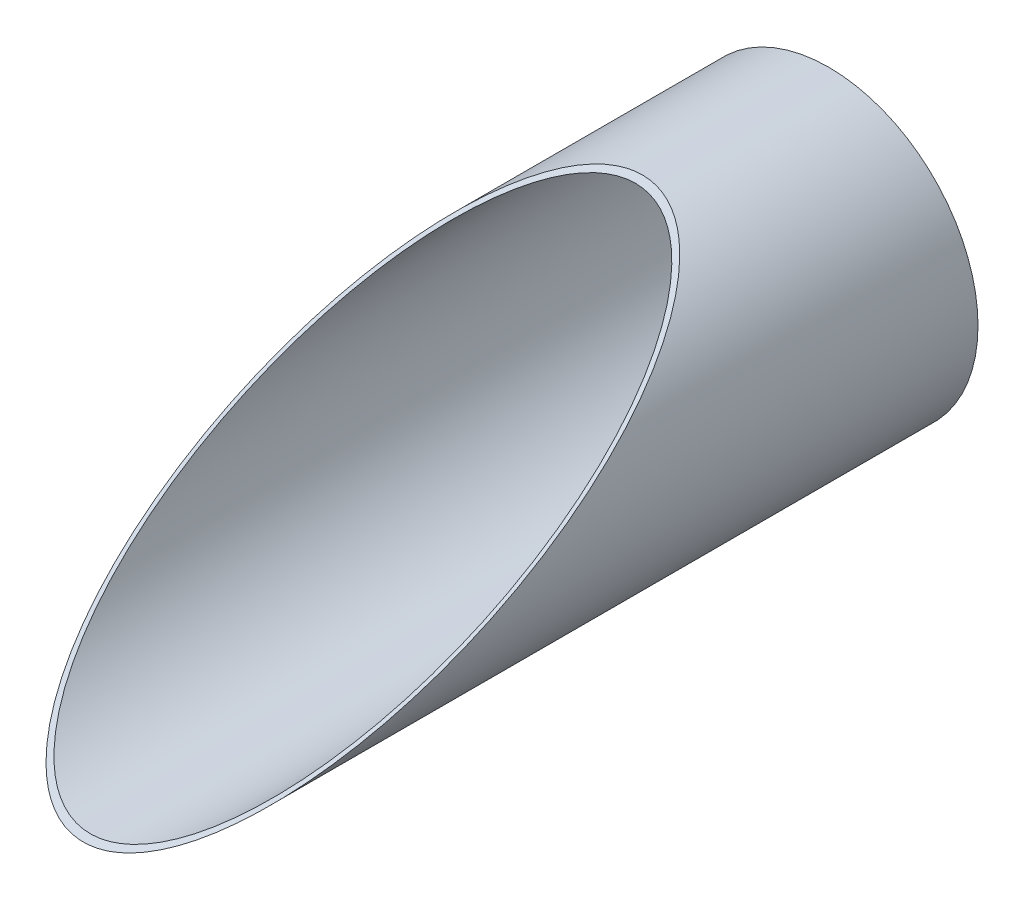
ISO-10303-21;
HEADER;
FILE_DESCRIPTION(('STEP AP214'),'2;1');
FILE_NAME('part.step','',(''),(''),'','','');
FILE_SCHEMA(('AUTOMOTIVE_DESIGN { 1 0 10303 214 1 1 1 1 }'));
ENDSEC;
DATA;
#1=APPLICATION_CONTEXT('core data for automotive mechanical design processes');
#2=APPLICATION_PROTOCOL_DEFINITION('international standard','automotive_design',2000,#1);
#3=PRODUCT_CONTEXT('',#1,'mechanical');
#4=PRODUCT('Part','Part','',(#3));
#5=PRODUCT_RELATED_PRODUCT_CATEGORY('part','',(#4));
#6=PRODUCT_DEFINITION_FORMATION('','',#4);
#7=PRODUCT_DEFINITION_CONTEXT('part definition',#1,'design');
#8=PRODUCT_DEFINITION('design','',#6,#7);
#9=PRODUCT_DEFINITION_SHAPE('','',#8);
#10=(LENGTH_UNIT() NAMED_UNIT(*) SI_UNIT(.MILLI.,.METRE.));
#11=(NAMED_UNIT(*) PLANE_ANGLE_UNIT() SI_UNIT($,.RADIAN.));
#12=(NAMED_UNIT(*) SI_UNIT($,.STERADIAN.) SOLID_ANGLE_UNIT());
#13=UNCERTAINTY_MEASURE_WITH_UNIT(LENGTH_MEASURE(1.E-05),#10,'distance_accuracy_value','');
#14=(GEOMETRIC_REPRESENTATION_CONTEXT(3) GLOBAL_UNCERTAINTY_ASSIGNED_CONTEXT((#13)) GLOBAL_UNIT_ASSIGNED_CONTEXT((#10,
#11,#12)) REPRESENTATION_CONTEXT('',''));
#15=CARTESIAN_POINT('',(0.,0.,0.));
#16=DIRECTION('',(0.,0.,1.));
#17=DIRECTION('',(1.,0.,0.));
#18=AXIS2_PLACEMENT_3D('',#15,#16,#17);
#19=CARTESIAN_POINT('',(0.,0.,100.));
#20=DIRECTION('',(0.,0.,-1.));
#21=DIRECTION('',(-1.,0.,0.));
#22=AXIS2_PLACEMENT_3D('',#19,#20,#21);
#23=CYLINDRICAL_SURFACE('',#22,20.);
#24=CARTESIAN_POINT('',(0.,0.,0.));
#25=DIRECTION('',(0.,0.,1.));
#26=DIRECTION('',(1.,0.,0.));
#27=AXIS2_PLACEMENT_3D('',#24,#25,#26);
#28=CIRCLE('',#27,20.);
#29=CARTESIAN_POINT('',(20.,0.,0.));
#30=VERTEX_POINT('',#29);
#31=EDGE_CURVE('E10',#30,#30,#28,.T.);
#32=ORIENTED_EDGE('',*,*,#31,.T.);
#33=EDGE_LOOP('',(#32));
#34=FACE_BOUND('',#33,.T.);
#35=CARTESIAN_POINT('',(0.,0.,62.5));
#36=DIRECTION('',(0.,-0.882352941176471,-0.470588235294118));
#37=DIRECTION('',(0.,0.470588235294118,-0.882352941176471));
#38=AXIS2_PLACEMENT_3D('',#35,#36,#37);
#39=ELLIPSE('',#38,42.5,20.);
#40=CARTESIAN_POINT('',(0.,20.,25.));
#41=VERTEX_POINT('',#40);
#42=EDGE_CURVE('E44',#41,#41,#39,.T.);
#43=ORIENTED_EDGE('',*,*,#42,.T.);
#44=EDGE_LOOP('',(#43));
#45=FACE_BOUND('',#44,.T.);
#46=ADVANCED_FACE('F37',(#34,#45),#23,.T.);
#47=CARTESIAN_POINT('',(0.,0.,0.));
#48=DIRECTION('',(0.,0.,1.));
#49=DIRECTION('',(1.,0.,0.));
#50=AXIS2_PLACEMENT_3D('',#47,#48,#49);
#51=PLANE('',#50);
#52=CARTESIAN_POINT('',(0.,0.,0.));
#53=DIRECTION('',(0.,0.,1.));
#54=DIRECTION('',(1.,0.,0.));
#55=AXIS2_PLACEMENT_3D('',#52,#53,#54);
#56=CIRCLE('',#55,19.5);
#57=CARTESIAN_POINT('',(19.5,0.,0.));
#58=VERTEX_POINT('',#57);
#59=EDGE_CURVE('E49',#58,#58,#56,.T.);
#60=ORIENTED_EDGE('',*,*,#59,.T.);
#61=EDGE_LOOP('',(#60));
#62=FACE_BOUND('',#61,.T.);
#63=ORIENTED_EDGE('',*,*,#31,.F.);
#64=EDGE_LOOP('',(#63));
#65=FACE_BOUND('',#64,.T.);
#66=ADVANCED_FACE('F71',(#62,#65),#51,.F.);
#67=CARTESIAN_POINT('',(-20.,-20.,100.));
#68=DIRECTION('',(0.,-0.882352941176471,-0.470588235294118));
#69=DIRECTION('',(0.,0.470588235294118,-0.882352941176471));
#70=AXIS2_PLACEMENT_3D('',#67,#68,#69);
#71=PLANE('',#70);
#72=CARTESIAN_POINT('',(0.,0.,62.5));
#73=DIRECTION('',(0.,-0.882352941176471,-0.470588235294118));
#74=DIRECTION('',(0.,0.470588235294118,-0.882352941176471));
#75=AXIS2_PLACEMENT_3D('',#72,#73,#74);
#76=ELLIPSE('',#75,41.4375,19.5);
#77=CARTESIAN_POINT('',(0.,19.5,25.9375));
#78=VERTEX_POINT('',#77);
#79=EDGE_CURVE('E54',#78,#78,#76,.T.);
#80=ORIENTED_EDGE('',*,*,#79,.T.);
#81=EDGE_LOOP('',(#80));
#82=FACE_BOUND('',#81,.T.);
#83=ORIENTED_EDGE('',*,*,#42,.F.);
#84=EDGE_LOOP('',(#83));
#85=FACE_BOUND('',#84,.T.);
#86=ADVANCED_FACE('F61',(#82,#85),#71,.F.);
#87=CARTESIAN_POINT('',(0.,0.,100.));
#88=DIRECTION('',(0.,0.,-1.));
#89=DIRECTION('',(-1.,0.,0.));
#90=AXIS2_PLACEMENT_3D('',#87,#88,#89);
#91=CYLINDRICAL_SURFACE('',#90,19.5);
#92=ORIENTED_EDGE('',*,*,#59,.F.);
#93=EDGE_LOOP('',(#92));
#94=FACE_BOUND('',#93,.T.);
#95=ORIENTED_EDGE('',*,*,#79,.F.);
#96=EDGE_LOOP('',(#95));
#97=FACE_BOUND('',#96,.T.);
#98=ADVANCED_FACE('F64',(#94,#97),#91,.F.);
#99=CLOSED_SHELL('',(#46,#66,#86,#98));
#100=MANIFOLD_SOLID_BREP('B2',#99);
#101=ADVANCED_BREP_SHAPE_REPRESENTATION('',(#18,#100),#14);
#102=SHAPE_DEFINITION_REPRESENTATION(#9,#101);
ENDSEC;
END-ISO-10303-21;
